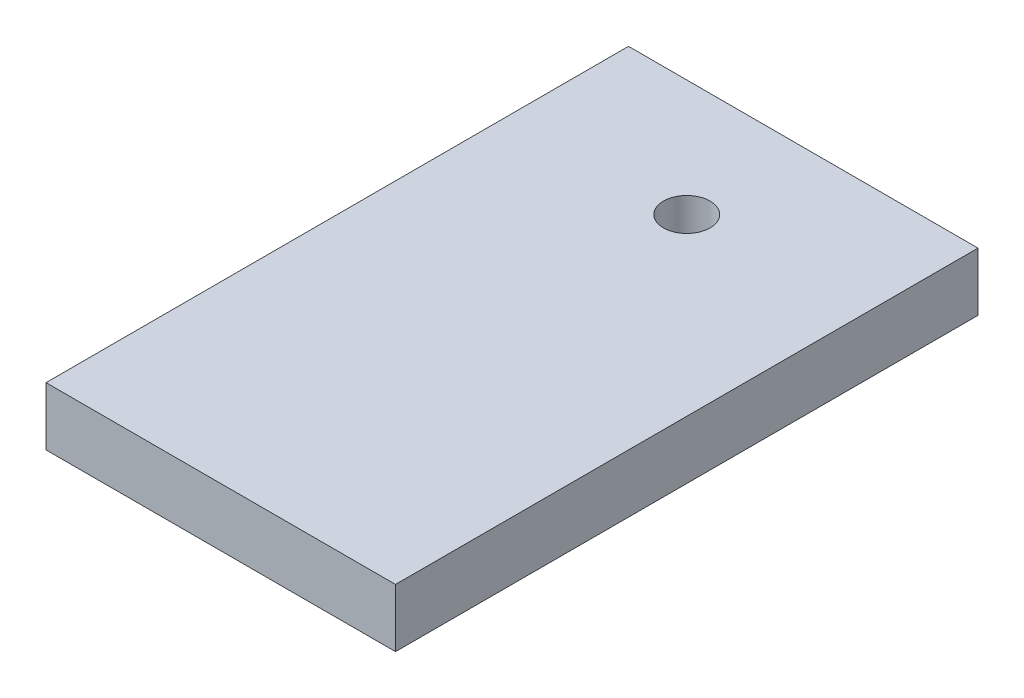
ISO-10303-21;
HEADER;
FILE_DESCRIPTION(('STEP AP214'),'2;1');
FILE_NAME('part.step','',(''),(''),'','','');
FILE_SCHEMA(('AUTOMOTIVE_DESIGN { 1 0 10303 214 1 1 1 1 }'));
ENDSEC;
DATA;
#1=APPLICATION_CONTEXT('core data for automotive mechanical design processes');
#2=APPLICATION_PROTOCOL_DEFINITION('international standard','automotive_design',2000,#1);
#3=PRODUCT_CONTEXT('',#1,'mechanical');
#4=PRODUCT('Part','Part','',(#3));
#5=PRODUCT_RELATED_PRODUCT_CATEGORY('part','',(#4));
#6=PRODUCT_DEFINITION_FORMATION('','',#4);
#7=PRODUCT_DEFINITION_CONTEXT('part definition',#1,'design');
#8=PRODUCT_DEFINITION('design','',#6,#7);
#9=PRODUCT_DEFINITION_SHAPE('','',#8);
#10=(LENGTH_UNIT() NAMED_UNIT(*) SI_UNIT(.MILLI.,.METRE.));
#11=(NAMED_UNIT(*) PLANE_ANGLE_UNIT() SI_UNIT($,.RADIAN.));
#12=(NAMED_UNIT(*) SI_UNIT($,.STERADIAN.) SOLID_ANGLE_UNIT());
#13=UNCERTAINTY_MEASURE_WITH_UNIT(LENGTH_MEASURE(1.E-05),#10,'distance_accuracy_value','');
#14=(GEOMETRIC_REPRESENTATION_CONTEXT(3) GLOBAL_UNCERTAINTY_ASSIGNED_CONTEXT((#13)) GLOBAL_UNIT_ASSIGNED_CONTEXT((#10,
#11,#12)) REPRESENTATION_CONTEXT('',''));
#15=CARTESIAN_POINT('',(0.,0.,0.));
#16=DIRECTION('',(0.,0.,1.));
#17=DIRECTION('',(1.,0.,0.));
#18=AXIS2_PLACEMENT_3D('',#15,#16,#17);
#19=CARTESIAN_POINT('',(0.,-2.54,25.4));
#20=DIRECTION('',(-1.,0.,0.));
#21=DIRECTION('',(0.,0.,1.));
#22=AXIS2_PLACEMENT_3D('',#19,#20,#21);
#23=PLANE('',#22);
#24=DIRECTION('',(0.,0.,1.));
#25=VECTOR('',#24,1.);
#26=CARTESIAN_POINT('',(0.,0.,25.4));
#27=LINE('',#26,#25);
#28=CARTESIAN_POINT('',(0.,0.,0.));
#29=VERTEX_POINT('',#28);
#30=CARTESIAN_POINT('',(0.,0.,25.4));
#31=VERTEX_POINT('',#30);
#32=EDGE_CURVE('E101',#29,#31,#27,.T.);
#33=ORIENTED_EDGE('',*,*,#32,.F.);
#34=DIRECTION('',(0.,1.,0.));
#35=VECTOR('',#34,1.);
#36=CARTESIAN_POINT('',(0.,-2.54,0.));
#37=LINE('',#36,#35);
#38=CARTESIAN_POINT('',(0.,-2.54,0.));
#39=VERTEX_POINT('',#38);
#40=EDGE_CURVE('E11',#39,#29,#37,.T.);
#41=ORIENTED_EDGE('',*,*,#40,.F.);
#42=DIRECTION('',(0.,0.,1.));
#43=VECTOR('',#42,1.);
#44=CARTESIAN_POINT('',(0.,-2.54,25.4));
#45=LINE('',#44,#43);
#46=CARTESIAN_POINT('',(0.,-2.54,25.4));
#47=VERTEX_POINT('',#46);
#48=EDGE_CURVE('E94',#39,#47,#45,.T.);
#49=ORIENTED_EDGE('',*,*,#48,.T.);
#50=DIRECTION('',(0.,1.,0.));
#51=VECTOR('',#50,1.);
#52=CARTESIAN_POINT('',(0.,-2.54,25.4));
#53=LINE('',#52,#51);
#54=EDGE_CURVE('E39',#47,#31,#53,.T.);
#55=ORIENTED_EDGE('',*,*,#54,.T.);
#56=EDGE_LOOP('',(#33,#41,#49,#55));
#57=FACE_BOUND('',#56,.T.);
#58=ADVANCED_FACE('F36',(#57),#23,.T.);
#59=CARTESIAN_POINT('',(0.,-2.54,0.));
#60=DIRECTION('',(0.,0.,-1.));
#61=DIRECTION('',(-1.,0.,0.));
#62=AXIS2_PLACEMENT_3D('',#59,#60,#61);
#63=PLANE('',#62);
#64=DIRECTION('',(-1.,0.,0.));
#65=VECTOR('',#64,1.);
#66=CARTESIAN_POINT('',(0.,0.,0.));
#67=LINE('',#66,#65);
#68=CARTESIAN_POINT('',(15.24,0.,0.));
#69=VERTEX_POINT('',#68);
#70=EDGE_CURVE('E96',#69,#29,#67,.T.);
#71=ORIENTED_EDGE('',*,*,#70,.F.);
#72=DIRECTION('',(0.,1.,0.));
#73=VECTOR('',#72,1.);
#74=CARTESIAN_POINT('',(15.24,-2.54,0.));
#75=LINE('',#74,#73);
#76=CARTESIAN_POINT('',(15.24,-2.54,0.));
#77=VERTEX_POINT('',#76);
#78=EDGE_CURVE('E45',#77,#69,#75,.T.);
#79=ORIENTED_EDGE('',*,*,#78,.F.);
#80=DIRECTION('',(-1.,0.,0.));
#81=VECTOR('',#80,1.);
#82=CARTESIAN_POINT('',(0.,-2.54,0.));
#83=LINE('',#82,#81);
#84=EDGE_CURVE('E91',#77,#39,#83,.T.);
#85=ORIENTED_EDGE('',*,*,#84,.T.);
#86=ORIENTED_EDGE('',*,*,#40,.T.);
#87=EDGE_LOOP('',(#71,#79,#85,#86));
#88=FACE_BOUND('',#87,.T.);
#89=ADVANCED_FACE('F112',(#88),#63,.T.);
#90=CARTESIAN_POINT('',(15.24,-2.54,0.));
#91=DIRECTION('',(1.,0.,0.));
#92=DIRECTION('',(0.,0.,-1.));
#93=AXIS2_PLACEMENT_3D('',#90,#91,#92);
#94=PLANE('',#93);
#95=DIRECTION('',(0.,0.,-1.));
#96=VECTOR('',#95,1.);
#97=CARTESIAN_POINT('',(15.24,0.,0.));
#98=LINE('',#97,#96);
#99=CARTESIAN_POINT('',(15.24,0.,25.4));
#100=VERTEX_POINT('',#99);
#101=EDGE_CURVE('E86',#100,#69,#98,.T.);
#102=ORIENTED_EDGE('',*,*,#101,.F.);
#103=DIRECTION('',(0.,1.,0.));
#104=VECTOR('',#103,1.);
#105=CARTESIAN_POINT('',(15.24,-2.54,25.4));
#106=LINE('',#105,#104);
#107=CARTESIAN_POINT('',(15.24,-2.54,25.4));
#108=VERTEX_POINT('',#107);
#109=EDGE_CURVE('E81',#108,#100,#106,.T.);
#110=ORIENTED_EDGE('',*,*,#109,.F.);
#111=DIRECTION('',(0.,0.,-1.));
#112=VECTOR('',#111,1.);
#113=CARTESIAN_POINT('',(15.24,-2.54,0.));
#114=LINE('',#113,#112);
#115=EDGE_CURVE('E84',#108,#77,#114,.T.);
#116=ORIENTED_EDGE('',*,*,#115,.T.);
#117=ORIENTED_EDGE('',*,*,#78,.T.);
#118=EDGE_LOOP('',(#102,#110,#116,#117));
#119=FACE_BOUND('',#118,.T.);
#120=ADVANCED_FACE('F83',(#119),#94,.T.);
#121=CARTESIAN_POINT('',(15.24,-2.54,25.4));
#122=DIRECTION('',(0.,0.,1.));
#123=DIRECTION('',(1.,0.,0.));
#124=AXIS2_PLACEMENT_3D('',#121,#122,#123);
#125=PLANE('',#124);
#126=DIRECTION('',(1.,0.,0.));
#127=VECTOR('',#126,1.);
#128=CARTESIAN_POINT('',(15.24,0.,25.4));
#129=LINE('',#128,#127);
#130=EDGE_CURVE('E104',#31,#100,#129,.T.);
#131=ORIENTED_EDGE('',*,*,#130,.F.);
#132=ORIENTED_EDGE('',*,*,#54,.F.);
#133=DIRECTION('',(1.,0.,0.));
#134=VECTOR('',#133,1.);
#135=CARTESIAN_POINT('',(15.24,-2.54,25.4));
#136=LINE('',#135,#134);
#137=EDGE_CURVE('E90',#47,#108,#136,.T.);
#138=ORIENTED_EDGE('',*,*,#137,.T.);
#139=ORIENTED_EDGE('',*,*,#109,.T.);
#140=EDGE_LOOP('',(#131,#132,#138,#139));
#141=FACE_BOUND('',#140,.T.);
#142=ADVANCED_FACE('F93',(#141),#125,.T.);
#143=CARTESIAN_POINT('',(0.,-2.54,0.));
#144=DIRECTION('',(0.,-1.,0.));
#145=DIRECTION('',(0.,0.,-1.));
#146=AXIS2_PLACEMENT_3D('',#143,#144,#145);
#147=PLANE('',#146);
#148=CARTESIAN_POINT('',(7.62,-2.54,5.08));
#149=DIRECTION('',(0.,1.,0.));
#150=DIRECTION('',(0.,0.,1.));
#151=AXIS2_PLACEMENT_3D('',#148,#149,#150);
#152=CIRCLE('',#151,1.016);
#153=CARTESIAN_POINT('',(7.62,-2.54,6.096));
#154=VERTEX_POINT('',#153);
#155=EDGE_CURVE('E105',#154,#154,#152,.T.);
#156=ORIENTED_EDGE('',*,*,#155,.T.);
#157=EDGE_LOOP('',(#156));
#158=FACE_BOUND('',#157,.T.);
#159=ORIENTED_EDGE('',*,*,#48,.F.);
#160=ORIENTED_EDGE('',*,*,#84,.F.);
#161=ORIENTED_EDGE('',*,*,#115,.F.);
#162=ORIENTED_EDGE('',*,*,#137,.F.);
#163=EDGE_LOOP('',(#159,#160,#161,#162));
#164=FACE_BOUND('',#163,.T.);
#165=ADVANCED_FACE('F89',(#158,#164),#147,.T.);
#166=CARTESIAN_POINT('',(0.,0.,0.));
#167=DIRECTION('',(0.,-1.,0.));
#168=DIRECTION('',(0.,0.,-1.));
#169=AXIS2_PLACEMENT_3D('',#166,#167,#168);
#170=PLANE('',#169);
#171=CARTESIAN_POINT('',(7.62,0.,5.08));
#172=DIRECTION('',(0.,1.,0.));
#173=DIRECTION('',(0.,0.,1.));
#174=AXIS2_PLACEMENT_3D('',#171,#172,#173);
#175=CIRCLE('',#174,1.016);
#176=CARTESIAN_POINT('',(7.62,0.,6.096));
#177=VERTEX_POINT('',#176);
#178=EDGE_CURVE('E142',#177,#177,#175,.T.);
#179=ORIENTED_EDGE('',*,*,#178,.F.);
#180=EDGE_LOOP('',(#179));
#181=FACE_BOUND('',#180,.T.);
#182=ORIENTED_EDGE('',*,*,#32,.T.);
#183=ORIENTED_EDGE('',*,*,#130,.T.);
#184=ORIENTED_EDGE('',*,*,#101,.T.);
#185=ORIENTED_EDGE('',*,*,#70,.T.);
#186=EDGE_LOOP('',(#182,#183,#184,#185));
#187=FACE_BOUND('',#186,.T.);
#188=ADVANCED_FACE('F111',(#181,#187),#170,.F.);
#189=CARTESIAN_POINT('',(7.62,-2.54,5.08));
#190=DIRECTION('',(0.,1.,0.));
#191=DIRECTION('',(0.,0.,1.));
#192=AXIS2_PLACEMENT_3D('',#189,#190,#191);
#193=CYLINDRICAL_SURFACE('',#192,1.016);
#194=ORIENTED_EDGE('',*,*,#155,.F.);
#195=EDGE_LOOP('',(#194));
#196=FACE_BOUND('',#195,.T.);
#197=ORIENTED_EDGE('',*,*,#178,.T.);
#198=EDGE_LOOP('',(#197));
#199=FACE_BOUND('',#198,.T.);
#200=ADVANCED_FACE('F130',(#196,#199),#193,.F.);
#201=CLOSED_SHELL('',(#58,#89,#120,#142,#165,#188,#200));
#202=MANIFOLD_SOLID_BREP('B2',#201);
#203=ADVANCED_BREP_SHAPE_REPRESENTATION('',(#18,#202),#14);
#204=SHAPE_DEFINITION_REPRESENTATION(#9,#203);
ENDSEC;
END-ISO-10303-21;
